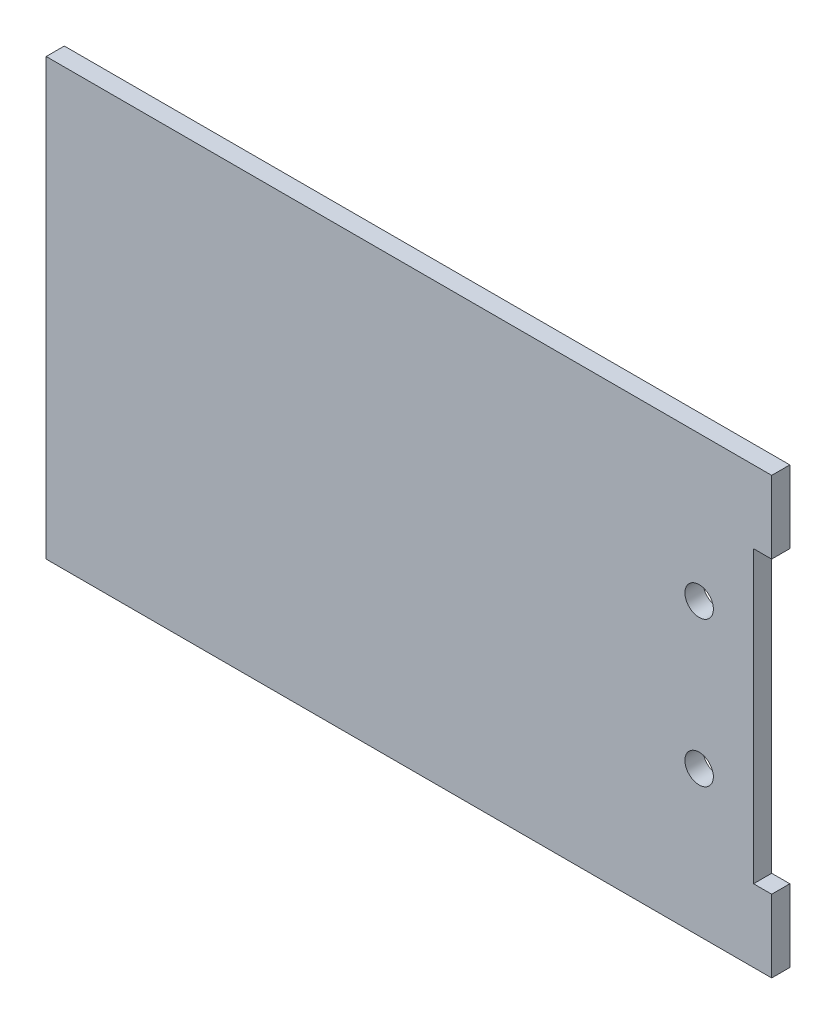
ISO-10303-21;
HEADER;
FILE_DESCRIPTION(('STEP AP214'),'2;1');
FILE_NAME('part.step','',(''),(''),'','','');
FILE_SCHEMA(('AUTOMOTIVE_DESIGN { 1 0 10303 214 1 1 1 1 }'));
ENDSEC;
DATA;
#1=APPLICATION_CONTEXT('core data for automotive mechanical design processes');
#2=APPLICATION_PROTOCOL_DEFINITION('international standard','automotive_design',2000,#1);
#3=PRODUCT_CONTEXT('',#1,'mechanical');
#4=PRODUCT('Part','Part','',(#3));
#5=PRODUCT_RELATED_PRODUCT_CATEGORY('part','',(#4));
#6=PRODUCT_DEFINITION_FORMATION('','',#4);
#7=PRODUCT_DEFINITION_CONTEXT('part definition',#1,'design');
#8=PRODUCT_DEFINITION('design','',#6,#7);
#9=PRODUCT_DEFINITION_SHAPE('','',#8);
#10=(LENGTH_UNIT() NAMED_UNIT(*) SI_UNIT(.MILLI.,.METRE.));
#11=(NAMED_UNIT(*) PLANE_ANGLE_UNIT() SI_UNIT($,.RADIAN.));
#12=(NAMED_UNIT(*) SI_UNIT($,.STERADIAN.) SOLID_ANGLE_UNIT());
#13=UNCERTAINTY_MEASURE_WITH_UNIT(LENGTH_MEASURE(1.E-05),#10,'distance_accuracy_value','');
#14=(GEOMETRIC_REPRESENTATION_CONTEXT(3) GLOBAL_UNCERTAINTY_ASSIGNED_CONTEXT((#13)) GLOBAL_UNIT_ASSIGNED_CONTEXT((#10,
#11,#12)) REPRESENTATION_CONTEXT('',''));
#15=CARTESIAN_POINT('',(0.,0.,0.));
#16=DIRECTION('',(0.,0.,1.));
#17=DIRECTION('',(1.,0.,0.));
#18=AXIS2_PLACEMENT_3D('',#15,#16,#17);
#19=CARTESIAN_POINT('',(63.5,-38.1,3.175));
#20=DIRECTION('',(-1.,0.,0.));
#21=DIRECTION('',(0.,0.,1.));
#22=AXIS2_PLACEMENT_3D('',#19,#20,#21);
#23=PLANE('',#22);
#24=DIRECTION('',(0.,0.,-1.));
#25=VECTOR('',#24,1.);
#26=CARTESIAN_POINT('',(63.5,-25.4,192.3190074632));
#27=LINE('',#26,#25);
#28=CARTESIAN_POINT('',(63.5,-25.4,3.17500000000001));
#29=VERTEX_POINT('',#28);
#30=CARTESIAN_POINT('',(63.5,-25.4,0.));
#31=VERTEX_POINT('',#30);
#32=EDGE_CURVE('E61',#29,#31,#27,.T.);
#33=ORIENTED_EDGE('',*,*,#32,.F.);
#34=DIRECTION('',(0.,1.,0.));
#35=VECTOR('',#34,1.);
#36=CARTESIAN_POINT('',(63.5,-38.1,3.175));
#37=LINE('',#36,#35);
#38=CARTESIAN_POINT('',(63.5,-38.1,3.175));
#39=VERTEX_POINT('',#38);
#40=EDGE_CURVE('E142',#39,#29,#37,.T.);
#41=ORIENTED_EDGE('',*,*,#40,.F.);
#42=DIRECTION('',(0.,0.,-1.));
#43=VECTOR('',#42,1.);
#44=CARTESIAN_POINT('',(63.5,-38.1,3.175));
#45=LINE('',#44,#43);
#46=CARTESIAN_POINT('',(63.5,-38.1,0.));
#47=VERTEX_POINT('',#46);
#48=EDGE_CURVE('E195',#39,#47,#45,.T.);
#49=ORIENTED_EDGE('',*,*,#48,.T.);
#50=DIRECTION('',(0.,1.,0.));
#51=VECTOR('',#50,1.);
#52=CARTESIAN_POINT('',(63.5,-38.1,0.));
#53=LINE('',#52,#51);
#54=EDGE_CURVE('E172',#47,#31,#53,.T.);
#55=ORIENTED_EDGE('',*,*,#54,.T.);
#56=EDGE_LOOP('',(#33,#41,#49,#55));
#57=FACE_BOUND('',#56,.T.);
#58=ADVANCED_FACE('F45',(#57),#23,.F.);
#59=CARTESIAN_POINT('',(0.,0.,3.175));
#60=DIRECTION('',(0.,0.,-1.));
#61=DIRECTION('',(-1.,0.,0.));
#62=AXIS2_PLACEMENT_3D('',#59,#60,#61);
#63=PLANE('',#62);
#64=CARTESIAN_POINT('',(50.8,12.7,3.175));
#65=DIRECTION('',(0.,0.,1.));
#66=DIRECTION('',(1.,0.,0.));
#67=AXIS2_PLACEMENT_3D('',#64,#65,#66);
#68=CIRCLE('',#67,2.48919999999999);
#69=CARTESIAN_POINT('',(53.2892,12.7,3.175));
#70=VERTEX_POINT('',#69);
#71=EDGE_CURVE('E160',#70,#70,#68,.T.);
#72=ORIENTED_EDGE('',*,*,#71,.F.);
#73=EDGE_LOOP('',(#72));
#74=FACE_BOUND('',#73,.T.);
#75=CARTESIAN_POINT('',(50.8,-12.7,3.175));
#76=DIRECTION('',(0.,0.,1.));
#77=DIRECTION('',(1.,0.,0.));
#78=AXIS2_PLACEMENT_3D('',#75,#76,#77);
#79=CIRCLE('',#78,2.48919999999999);
#80=CARTESIAN_POINT('',(53.2892,-12.7,3.175));
#81=VERTEX_POINT('',#80);
#82=EDGE_CURVE('E152',#81,#81,#79,.T.);
#83=ORIENTED_EDGE('',*,*,#82,.F.);
#84=EDGE_LOOP('',(#83));
#85=FACE_BOUND('',#84,.T.);
#86=DIRECTION('',(-1.,0.,0.));
#87=VECTOR('',#86,1.);
#88=CARTESIAN_POINT('',(0.,25.3999999999999,3.175));
#89=LINE('',#88,#87);
#90=CARTESIAN_POINT('',(63.5,25.4,3.17500000000001));
#91=VERTEX_POINT('',#90);
#92=CARTESIAN_POINT('',(60.325,25.4,3.17500000000001));
#93=VERTEX_POINT('',#92);
#94=EDGE_CURVE('E132',#91,#93,#89,.T.);
#95=ORIENTED_EDGE('',*,*,#94,.F.);
#96=CARTESIAN_POINT('',(63.5,38.1,3.175));
#97=VERTEX_POINT('',#96);
#98=EDGE_CURVE('E70',#91,#97,#37,.T.);
#99=ORIENTED_EDGE('',*,*,#98,.T.);
#100=DIRECTION('',(-1.,0.,0.));
#101=VECTOR('',#100,1.);
#102=CARTESIAN_POINT('',(63.5,38.1,3.175));
#103=LINE('',#102,#101);
#104=CARTESIAN_POINT('',(-63.5,38.1,3.175));
#105=VERTEX_POINT('',#104);
#106=EDGE_CURVE('E169',#97,#105,#103,.T.);
#107=ORIENTED_EDGE('',*,*,#106,.T.);
#108=DIRECTION('',(0.,-1.,0.));
#109=VECTOR('',#108,1.);
#110=CARTESIAN_POINT('',(-63.5,-38.1,3.175));
#111=LINE('',#110,#109);
#112=CARTESIAN_POINT('',(-63.5,-38.1,3.175));
#113=VERTEX_POINT('',#112);
#114=EDGE_CURVE('E100',#105,#113,#111,.T.);
#115=ORIENTED_EDGE('',*,*,#114,.T.);
#116=DIRECTION('',(1.,0.,0.));
#117=VECTOR('',#116,1.);
#118=CARTESIAN_POINT('',(63.5,-38.1,3.175));
#119=LINE('',#118,#117);
#120=EDGE_CURVE('E175',#113,#39,#119,.T.);
#121=ORIENTED_EDGE('',*,*,#120,.T.);
#122=ORIENTED_EDGE('',*,*,#40,.T.);
#123=DIRECTION('',(1.,0.,0.));
#124=VECTOR('',#123,1.);
#125=CARTESIAN_POINT('',(0.,-25.4,3.175));
#126=LINE('',#125,#124);
#127=CARTESIAN_POINT('',(60.325,-25.4,3.17500000000001));
#128=VERTEX_POINT('',#127);
#129=EDGE_CURVE('E133',#128,#29,#126,.T.);
#130=ORIENTED_EDGE('',*,*,#129,.F.);
#131=DIRECTION('',(0.,-1.,0.));
#132=VECTOR('',#131,1.);
#133=CARTESIAN_POINT('',(60.325,0.,3.175));
#134=LINE('',#133,#132);
#135=EDGE_CURVE('E123',#93,#128,#134,.T.);
#136=ORIENTED_EDGE('',*,*,#135,.F.);
#137=EDGE_LOOP('',(#95,#99,#107,#115,#121,#122,#130,#136));
#138=FACE_BOUND('',#137,.T.);
#139=ADVANCED_FACE('F140',(#74,#85,#138),#63,.F.);
#140=CARTESIAN_POINT('',(0.,0.,0.));
#141=DIRECTION('',(0.,0.,-1.));
#142=DIRECTION('',(-1.,0.,0.));
#143=AXIS2_PLACEMENT_3D('',#140,#141,#142);
#144=PLANE('',#143);
#145=CARTESIAN_POINT('',(50.8,-12.7,0.));
#146=DIRECTION('',(0.,0.,1.));
#147=DIRECTION('',(1.,0.,0.));
#148=AXIS2_PLACEMENT_3D('',#145,#146,#147);
#149=CIRCLE('',#148,2.4892);
#150=CARTESIAN_POINT('',(53.2892,-12.7,0.));
#151=VERTEX_POINT('',#150);
#152=EDGE_CURVE('E156',#151,#151,#149,.T.);
#153=ORIENTED_EDGE('',*,*,#152,.T.);
#154=EDGE_LOOP('',(#153));
#155=FACE_BOUND('',#154,.T.);
#156=CARTESIAN_POINT('',(50.8,12.7,0.));
#157=DIRECTION('',(0.,0.,1.));
#158=DIRECTION('',(1.,0.,0.));
#159=AXIS2_PLACEMENT_3D('',#156,#157,#158);
#160=CIRCLE('',#159,2.4892);
#161=CARTESIAN_POINT('',(53.2892,12.7,0.));
#162=VERTEX_POINT('',#161);
#163=EDGE_CURVE('E164',#162,#162,#160,.T.);
#164=ORIENTED_EDGE('',*,*,#163,.T.);
#165=EDGE_LOOP('',(#164));
#166=FACE_BOUND('',#165,.T.);
#167=CARTESIAN_POINT('',(63.5,25.4,0.));
#168=VERTEX_POINT('',#167);
#169=CARTESIAN_POINT('',(63.5,38.1,0.));
#170=VERTEX_POINT('',#169);
#171=EDGE_CURVE('E92',#168,#170,#53,.T.);
#172=ORIENTED_EDGE('',*,*,#171,.F.);
#173=DIRECTION('',(-1.,0.,0.));
#174=VECTOR('',#173,1.);
#175=CARTESIAN_POINT('',(0.,25.3999999999999,0.));
#176=LINE('',#175,#174);
#177=CARTESIAN_POINT('',(60.325,25.4,0.));
#178=VERTEX_POINT('',#177);
#179=EDGE_CURVE('E11',#168,#178,#176,.T.);
#180=ORIENTED_EDGE('',*,*,#179,.T.);
#181=DIRECTION('',(0.,-1.,0.));
#182=VECTOR('',#181,1.);
#183=CARTESIAN_POINT('',(60.325,0.,0.));
#184=LINE('',#183,#182);
#185=CARTESIAN_POINT('',(60.325,-25.4,0.));
#186=VERTEX_POINT('',#185);
#187=EDGE_CURVE('E54',#178,#186,#184,.T.);
#188=ORIENTED_EDGE('',*,*,#187,.T.);
#189=DIRECTION('',(1.,0.,0.));
#190=VECTOR('',#189,1.);
#191=CARTESIAN_POINT('',(0.,-25.4,0.));
#192=LINE('',#191,#190);
#193=EDGE_CURVE('E136',#186,#31,#192,.T.);
#194=ORIENTED_EDGE('',*,*,#193,.T.);
#195=ORIENTED_EDGE('',*,*,#54,.F.);
#196=DIRECTION('',(1.,0.,0.));
#197=VECTOR('',#196,1.);
#198=CARTESIAN_POINT('',(63.5,-38.1,0.));
#199=LINE('',#198,#197);
#200=CARTESIAN_POINT('',(-63.5,-38.1,0.));
#201=VERTEX_POINT('',#200);
#202=EDGE_CURVE('E187',#201,#47,#199,.T.);
#203=ORIENTED_EDGE('',*,*,#202,.F.);
#204=DIRECTION('',(0.,-1.,0.));
#205=VECTOR('',#204,1.);
#206=CARTESIAN_POINT('',(-63.5,-38.1,0.));
#207=LINE('',#206,#205);
#208=CARTESIAN_POINT('',(-63.5,38.1,0.));
#209=VERTEX_POINT('',#208);
#210=EDGE_CURVE('E184',#209,#201,#207,.T.);
#211=ORIENTED_EDGE('',*,*,#210,.F.);
#212=DIRECTION('',(-1.,0.,0.));
#213=VECTOR('',#212,1.);
#214=CARTESIAN_POINT('',(63.5,38.1,0.));
#215=LINE('',#214,#213);
#216=EDGE_CURVE('E168',#170,#209,#215,.T.);
#217=ORIENTED_EDGE('',*,*,#216,.F.);
#218=EDGE_LOOP('',(#172,#180,#188,#194,#195,#203,#211,#217));
#219=FACE_BOUND('',#218,.T.);
#220=ADVANCED_FACE('F209',(#155,#166,#219),#144,.T.);
#221=CARTESIAN_POINT('',(63.5,38.1,3.175));
#222=DIRECTION('',(0.,-1.,0.));
#223=DIRECTION('',(0.,0.,-1.));
#224=AXIS2_PLACEMENT_3D('',#221,#222,#223);
#225=PLANE('',#224);
#226=ORIENTED_EDGE('',*,*,#216,.T.);
#227=DIRECTION('',(0.,0.,-1.));
#228=VECTOR('',#227,1.);
#229=CARTESIAN_POINT('',(-63.5,38.1,3.175));
#230=LINE('',#229,#228);
#231=EDGE_CURVE('E203',#105,#209,#230,.T.);
#232=ORIENTED_EDGE('',*,*,#231,.F.);
#233=ORIENTED_EDGE('',*,*,#106,.F.);
#234=DIRECTION('',(0.,0.,-1.));
#235=VECTOR('',#234,1.);
#236=CARTESIAN_POINT('',(63.5,38.1,3.175));
#237=LINE('',#236,#235);
#238=EDGE_CURVE('E180',#97,#170,#237,.T.);
#239=ORIENTED_EDGE('',*,*,#238,.T.);
#240=EDGE_LOOP('',(#226,#232,#233,#239));
#241=FACE_BOUND('',#240,.T.);
#242=ADVANCED_FACE('F47',(#241),#225,.F.);
#243=CARTESIAN_POINT('',(-63.5,-38.1,3.175));
#244=DIRECTION('',(1.,0.,0.));
#245=DIRECTION('',(0.,0.,-1.));
#246=AXIS2_PLACEMENT_3D('',#243,#244,#245);
#247=PLANE('',#246);
#248=ORIENTED_EDGE('',*,*,#210,.T.);
#249=DIRECTION('',(0.,0.,-1.));
#250=VECTOR('',#249,1.);
#251=CARTESIAN_POINT('',(-63.5,-38.1,3.175));
#252=LINE('',#251,#250);
#253=EDGE_CURVE('E199',#113,#201,#252,.T.);
#254=ORIENTED_EDGE('',*,*,#253,.F.);
#255=ORIENTED_EDGE('',*,*,#114,.F.);
#256=ORIENTED_EDGE('',*,*,#231,.T.);
#257=EDGE_LOOP('',(#248,#254,#255,#256));
#258=FACE_BOUND('',#257,.T.);
#259=ADVANCED_FACE('F225',(#258),#247,.F.);
#260=CARTESIAN_POINT('',(63.5,-38.1,3.175));
#261=DIRECTION('',(0.,1.,0.));
#262=DIRECTION('',(0.,0.,1.));
#263=AXIS2_PLACEMENT_3D('',#260,#261,#262);
#264=PLANE('',#263);
#265=ORIENTED_EDGE('',*,*,#202,.T.);
#266=ORIENTED_EDGE('',*,*,#48,.F.);
#267=ORIENTED_EDGE('',*,*,#120,.F.);
#268=ORIENTED_EDGE('',*,*,#253,.T.);
#269=EDGE_LOOP('',(#265,#266,#267,#268));
#270=FACE_BOUND('',#269,.T.);
#271=ADVANCED_FACE('F228',(#270),#264,.F.);
#272=ORIENTED_EDGE('',*,*,#98,.F.);
#273=DIRECTION('',(0.,0.,-1.));
#274=VECTOR('',#273,1.);
#275=CARTESIAN_POINT('',(63.5,25.4,192.3190074632));
#276=LINE('',#275,#274);
#277=EDGE_CURVE('E144',#91,#168,#276,.T.);
#278=ORIENTED_EDGE('',*,*,#277,.T.);
#279=ORIENTED_EDGE('',*,*,#171,.T.);
#280=ORIENTED_EDGE('',*,*,#238,.F.);
#281=EDGE_LOOP('',(#272,#278,#279,#280));
#282=FACE_BOUND('',#281,.T.);
#283=ADVANCED_FACE('F216',(#282),#23,.F.);
#284=CARTESIAN_POINT('',(50.8,12.7,3.175));
#285=DIRECTION('',(0.,0.,1.));
#286=DIRECTION('',(1.,0.,0.));
#287=AXIS2_PLACEMENT_3D('',#284,#285,#286);
#288=CYLINDRICAL_SURFACE('',#287,2.48919999999999);
#289=ORIENTED_EDGE('',*,*,#163,.F.);
#290=EDGE_LOOP('',(#289));
#291=FACE_BOUND('',#290,.T.);
#292=ORIENTED_EDGE('',*,*,#71,.T.);
#293=EDGE_LOOP('',(#292));
#294=FACE_BOUND('',#293,.T.);
#295=ADVANCED_FACE('F241',(#291,#294),#288,.F.);
#296=CARTESIAN_POINT('',(50.8,-12.7,3.175));
#297=DIRECTION('',(0.,0.,1.));
#298=DIRECTION('',(1.,0.,0.));
#299=AXIS2_PLACEMENT_3D('',#296,#297,#298);
#300=CYLINDRICAL_SURFACE('',#299,2.48919999999999);
#301=ORIENTED_EDGE('',*,*,#152,.F.);
#302=EDGE_LOOP('',(#301));
#303=FACE_BOUND('',#302,.T.);
#304=ORIENTED_EDGE('',*,*,#82,.T.);
#305=EDGE_LOOP('',(#304));
#306=FACE_BOUND('',#305,.T.);
#307=ADVANCED_FACE('F247',(#303,#306),#300,.F.);
#308=CARTESIAN_POINT('',(63.5,25.4,192.3190074632));
#309=DIRECTION('',(0.,-1.,0.));
#310=DIRECTION('',(1.,0.,0.));
#311=AXIS2_PLACEMENT_3D('',#308,#309,#310);
#312=PLANE('',#311);
#313=ORIENTED_EDGE('',*,*,#277,.F.);
#314=ORIENTED_EDGE('',*,*,#94,.T.);
#315=DIRECTION('',(0.,0.,-1.));
#316=VECTOR('',#315,1.);
#317=CARTESIAN_POINT('',(60.325,25.4,192.3190074632));
#318=LINE('',#317,#316);
#319=EDGE_CURVE('E129',#93,#178,#318,.T.);
#320=ORIENTED_EDGE('',*,*,#319,.T.);
#321=ORIENTED_EDGE('',*,*,#179,.F.);
#322=EDGE_LOOP('',(#313,#314,#320,#321));
#323=FACE_BOUND('',#322,.T.);
#324=ADVANCED_FACE('F212',(#323),#312,.T.);
#325=CARTESIAN_POINT('',(60.325,25.4,192.3190074632));
#326=DIRECTION('',(1.,0.,0.));
#327=DIRECTION('',(0.,1.,0.));
#328=AXIS2_PLACEMENT_3D('',#325,#326,#327);
#329=PLANE('',#328);
#330=ORIENTED_EDGE('',*,*,#319,.F.);
#331=ORIENTED_EDGE('',*,*,#135,.T.);
#332=DIRECTION('',(0.,0.,-1.));
#333=VECTOR('',#332,1.);
#334=CARTESIAN_POINT('',(60.325,-25.4,192.3190074632));
#335=LINE('',#334,#333);
#336=EDGE_CURVE('E126',#128,#186,#335,.T.);
#337=ORIENTED_EDGE('',*,*,#336,.T.);
#338=ORIENTED_EDGE('',*,*,#187,.F.);
#339=EDGE_LOOP('',(#330,#331,#337,#338));
#340=FACE_BOUND('',#339,.T.);
#341=ADVANCED_FACE('F125',(#340),#329,.T.);
#342=CARTESIAN_POINT('',(60.325,-25.4,192.3190074632));
#343=DIRECTION('',(0.,1.,0.));
#344=DIRECTION('',(0.,0.,1.));
#345=AXIS2_PLACEMENT_3D('',#342,#343,#344);
#346=PLANE('',#345);
#347=ORIENTED_EDGE('',*,*,#336,.F.);
#348=ORIENTED_EDGE('',*,*,#129,.T.);
#349=ORIENTED_EDGE('',*,*,#32,.T.);
#350=ORIENTED_EDGE('',*,*,#193,.F.);
#351=EDGE_LOOP('',(#347,#348,#349,#350));
#352=FACE_BOUND('',#351,.T.);
#353=ADVANCED_FACE('F135',(#352),#346,.T.);
#354=CLOSED_SHELL('',(#58,#139,#220,#242,#259,#271,#283,#295,#307,#324,#341,#353));
#355=MANIFOLD_SOLID_BREP('B2',#354);
#356=ADVANCED_BREP_SHAPE_REPRESENTATION('',(#18,#355),#14);
#357=SHAPE_DEFINITION_REPRESENTATION(#9,#356);
ENDSEC;
END-ISO-10303-21;
